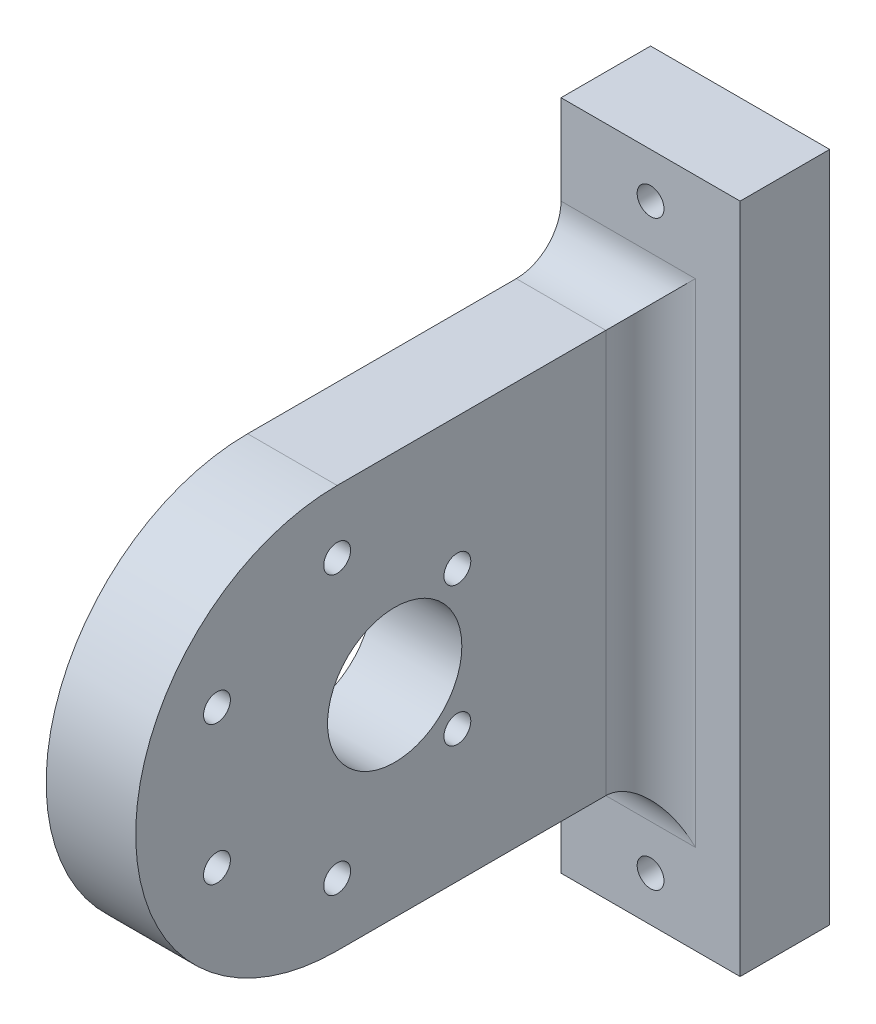
ISO-10303-21;
HEADER;
FILE_DESCRIPTION(('STEP AP214'),'2;1');
FILE_NAME('part.step','',(''),(''),'','','');
FILE_SCHEMA(('AUTOMOTIVE_DESIGN { 1 0 10303 214 1 1 1 1 }'));
ENDSEC;
DATA;
#1=APPLICATION_CONTEXT('core data for automotive mechanical design processes');
#2=APPLICATION_PROTOCOL_DEFINITION('international standard','automotive_design',2000,#1);
#3=PRODUCT_CONTEXT('',#1,'mechanical');
#4=PRODUCT('Part','Part','',(#3));
#5=PRODUCT_RELATED_PRODUCT_CATEGORY('part','',(#4));
#6=PRODUCT_DEFINITION_FORMATION('','',#4);
#7=PRODUCT_DEFINITION_CONTEXT('part definition',#1,'design');
#8=PRODUCT_DEFINITION('design','',#6,#7);
#9=PRODUCT_DEFINITION_SHAPE('','',#8);
#10=(LENGTH_UNIT() NAMED_UNIT(*) SI_UNIT(.MILLI.,.METRE.));
#11=(NAMED_UNIT(*) PLANE_ANGLE_UNIT() SI_UNIT($,.RADIAN.));
#12=(NAMED_UNIT(*) SI_UNIT($,.STERADIAN.) SOLID_ANGLE_UNIT());
#13=UNCERTAINTY_MEASURE_WITH_UNIT(LENGTH_MEASURE(1.E-05),#10,'distance_accuracy_value','');
#14=(GEOMETRIC_REPRESENTATION_CONTEXT(3) GLOBAL_UNCERTAINTY_ASSIGNED_CONTEXT((#13)) GLOBAL_UNIT_ASSIGNED_CONTEXT((#10,
#11,#12)) REPRESENTATION_CONTEXT('',''));
#15=CARTESIAN_POINT('',(0.,0.,0.));
#16=DIRECTION('',(0.,0.,1.));
#17=DIRECTION('',(1.,0.,0.));
#18=AXIS2_PLACEMENT_3D('',#15,#16,#17);
#19=CARTESIAN_POINT('',(15.,22.5,-30.));
#20=DIRECTION('',(0.,-1.,0.));
#21=DIRECTION('',(0.,0.,-1.));
#22=AXIS2_PLACEMENT_3D('',#19,#20,#21);
#23=CYLINDRICAL_SURFACE('',#22,5.);
#24=DIRECTION('',(0.,1.,0.));
#25=VECTOR('',#24,1.);
#26=CARTESIAN_POINT('',(10.,22.5,-30.));
#27=LINE('',#26,#25);
#28=CARTESIAN_POINT('',(10.,0.,-30.));
#29=VERTEX_POINT('',#28);
#30=CARTESIAN_POINT('',(10.,45.,-30.));
#31=VERTEX_POINT('',#30);
#32=EDGE_CURVE('E237',#29,#31,#27,.T.);
#33=ORIENTED_EDGE('',*,*,#32,.F.);
#34=CARTESIAN_POINT('',(15.,-5.,-30.));
#35=DIRECTION('',(-0.707106781186547,-0.707106781186547,0.));
#36=DIRECTION('',(-0.707106781186547,0.707106781186547,0.));
#37=AXIS2_PLACEMENT_3D('',#34,#35,#36);
#38=ELLIPSE('',#37,7.07106781186547,5.);
#39=CARTESIAN_POINT('',(15.,-5.,-35.));
#40=VERTEX_POINT('',#39);
#41=EDGE_CURVE('E42',#29,#40,#38,.T.);
#42=ORIENTED_EDGE('',*,*,#41,.T.);
#43=DIRECTION('',(0.,1.,0.));
#44=VECTOR('',#43,1.);
#45=CARTESIAN_POINT('',(15.,22.5,-35.));
#46=LINE('',#45,#44);
#47=CARTESIAN_POINT('',(15.,50.,-35.));
#48=VERTEX_POINT('',#47);
#49=EDGE_CURVE('E240',#48,#40,#46,.F.);
#50=ORIENTED_EDGE('',*,*,#49,.F.);
#51=CARTESIAN_POINT('',(15.,50.,-30.));
#52=DIRECTION('',(0.707106781186547,-0.707106781186547,0.));
#53=DIRECTION('',(0.707106781186547,0.707106781186547,0.));
#54=AXIS2_PLACEMENT_3D('',#51,#52,#53);
#55=ELLIPSE('',#54,7.07106781186547,5.);
#56=EDGE_CURVE('E11',#48,#31,#55,.F.);
#57=ORIENTED_EDGE('',*,*,#56,.T.);
#58=EDGE_LOOP('',(#33,#42,#50,#57));
#59=FACE_BOUND('',#58,.T.);
#60=ADVANCED_FACE('F35',(#59),#23,.F.);
#61=CARTESIAN_POINT('',(10.,22.5,0.));
#62=DIRECTION('',(-1.,0.,0.));
#63=DIRECTION('',(0.,0.,1.));
#64=AXIS2_PLACEMENT_3D('',#61,#62,#63);
#65=PLANE('',#64);
#66=CARTESIAN_POINT('',(10.,22.5,-6.42339375865879));
#67=DIRECTION('',(1.,0.,0.));
#68=DIRECTION('',(0.,0.,-1.));
#69=AXIS2_PLACEMENT_3D('',#66,#67,#68);
#70=CIRCLE('',#69,7.5);
#71=CARTESIAN_POINT('',(10.,22.5,-13.9233937586588));
#72=VERTEX_POINT('',#71);
#73=EDGE_CURVE('E148',#72,#72,#70,.T.);
#74=ORIENTED_EDGE('',*,*,#73,.F.);
#75=EDGE_LOOP('',(#74));
#76=FACE_BOUND('',#75,.T.);
#77=CARTESIAN_POINT('',(10.,14.7500000000001,-13.4233937586589));
#78=DIRECTION('',(1.,0.,0.));
#79=DIRECTION('',(0.,0.,-1.));
#80=AXIS2_PLACEMENT_3D('',#77,#78,#79);
#81=CIRCLE('',#80,1.5);
#82=CARTESIAN_POINT('',(10.,14.7500000000001,-14.9233937586589));
#83=VERTEX_POINT('',#82);
#84=EDGE_CURVE('E154',#83,#83,#81,.T.);
#85=ORIENTED_EDGE('',*,*,#84,.F.);
#86=EDGE_LOOP('',(#85));
#87=FACE_BOUND('',#86,.T.);
#88=CARTESIAN_POINT('',(10.,7.,-1.08235921504137E-13));
#89=DIRECTION('',(1.,0.,0.));
#90=DIRECTION('',(0.,0.,-1.));
#91=AXIS2_PLACEMENT_3D('',#88,#89,#90);
#92=CIRCLE('',#91,1.5);
#93=CARTESIAN_POINT('',(10.,7.,-1.50000000000011));
#94=VERTEX_POINT('',#93);
#95=EDGE_CURVE('E160',#94,#94,#92,.T.);
#96=ORIENTED_EDGE('',*,*,#95,.F.);
#97=EDGE_LOOP('',(#96));
#98=FACE_BOUND('',#97,.T.);
#99=CARTESIAN_POINT('',(10.,14.7499999999999,13.4233937586588));
#100=DIRECTION('',(1.,0.,0.));
#101=DIRECTION('',(0.,0.,-1.));
#102=AXIS2_PLACEMENT_3D('',#99,#100,#101);
#103=CIRCLE('',#102,1.5);
#104=CARTESIAN_POINT('',(10.,14.7499999999999,11.9233937586588));
#105=VERTEX_POINT('',#104);
#106=EDGE_CURVE('E166',#105,#105,#103,.T.);
#107=ORIENTED_EDGE('',*,*,#106,.F.);
#108=EDGE_LOOP('',(#107));
#109=FACE_BOUND('',#108,.T.);
#110=CARTESIAN_POINT('',(10.,30.25,13.4233937586588));
#111=DIRECTION('',(1.,0.,0.));
#112=DIRECTION('',(0.,0.,-1.));
#113=AXIS2_PLACEMENT_3D('',#110,#111,#112);
#114=CIRCLE('',#113,1.5);
#115=CARTESIAN_POINT('',(10.,30.25,11.9233937586588));
#116=VERTEX_POINT('',#115);
#117=EDGE_CURVE('E172',#116,#116,#114,.T.);
#118=ORIENTED_EDGE('',*,*,#117,.F.);
#119=EDGE_LOOP('',(#118));
#120=FACE_BOUND('',#119,.T.);
#121=CARTESIAN_POINT('',(10.,38.,0.));
#122=DIRECTION('',(1.,0.,0.));
#123=DIRECTION('',(0.,0.,-1.));
#124=AXIS2_PLACEMENT_3D('',#121,#122,#123);
#125=CIRCLE('',#124,1.5);
#126=CARTESIAN_POINT('',(10.,38.,-1.5));
#127=VERTEX_POINT('',#126);
#128=EDGE_CURVE('E178',#127,#127,#125,.T.);
#129=ORIENTED_EDGE('',*,*,#128,.F.);
#130=EDGE_LOOP('',(#129));
#131=FACE_BOUND('',#130,.T.);
#132=CARTESIAN_POINT('',(10.,30.2500000000002,-13.4233937586587));
#133=DIRECTION('',(1.,0.,0.));
#134=DIRECTION('',(0.,0.,-1.));
#135=AXIS2_PLACEMENT_3D('',#132,#133,#134);
#136=CIRCLE('',#135,1.5);
#137=CARTESIAN_POINT('',(10.,30.2500000000002,-14.9233937586587));
#138=VERTEX_POINT('',#137);
#139=EDGE_CURVE('E184',#138,#138,#136,.T.);
#140=ORIENTED_EDGE('',*,*,#139,.F.);
#141=EDGE_LOOP('',(#140));
#142=FACE_BOUND('',#141,.T.);
#143=DIRECTION('',(0.,0.,-1.));
#144=VECTOR('',#143,1.);
#145=CARTESIAN_POINT('',(10.,0.,0.));
#146=LINE('',#145,#144);
#147=CARTESIAN_POINT('',(10.,0.,0.));
#148=VERTEX_POINT('',#147);
#149=EDGE_CURVE('E193',#148,#29,#146,.T.);
#150=ORIENTED_EDGE('',*,*,#149,.T.);
#151=ORIENTED_EDGE('',*,*,#32,.T.);
#152=DIRECTION('',(0.,0.,1.));
#153=VECTOR('',#152,1.);
#154=CARTESIAN_POINT('',(10.,45.,0.));
#155=LINE('',#154,#153);
#156=CARTESIAN_POINT('',(10.,45.,0.));
#157=VERTEX_POINT('',#156);
#158=EDGE_CURVE('E197',#31,#157,#155,.T.);
#159=ORIENTED_EDGE('',*,*,#158,.T.);
#160=CARTESIAN_POINT('',(10.,22.5,0.));
#161=DIRECTION('',(1.,0.,0.));
#162=DIRECTION('',(0.,0.,1.));
#163=AXIS2_PLACEMENT_3D('',#160,#161,#162);
#164=CIRCLE('',#163,22.5);
#165=EDGE_CURVE('E190',#157,#148,#164,.T.);
#166=ORIENTED_EDGE('',*,*,#165,.T.);
#167=EDGE_LOOP('',(#150,#151,#159,#166));
#168=FACE_BOUND('',#167,.T.);
#169=ADVANCED_FACE('F261',(#76,#87,#98,#109,#120,#131,#142,#168),#65,.F.);
#170=CARTESIAN_POINT('',(10.,-5.,-30.));
#171=DIRECTION('',(-1.,0.,0.));
#172=DIRECTION('',(0.,0.,1.));
#173=AXIS2_PLACEMENT_3D('',#170,#171,#172);
#174=CYLINDRICAL_SURFACE('',#173,5.);
#175=DIRECTION('',(1.,0.,0.));
#176=VECTOR('',#175,1.);
#177=CARTESIAN_POINT('',(10.,0.,-30.));
#178=LINE('',#177,#176);
#179=CARTESIAN_POINT('',(0.,0.,-30.));
#180=VERTEX_POINT('',#179);
#181=EDGE_CURVE('E231',#180,#29,#178,.T.);
#182=ORIENTED_EDGE('',*,*,#181,.F.);
#183=CARTESIAN_POINT('',(0.,-5.,-30.));
#184=DIRECTION('',(-1.,0.,0.));
#185=DIRECTION('',(0.,0.,1.));
#186=AXIS2_PLACEMENT_3D('',#183,#184,#185);
#187=CIRCLE('',#186,5.);
#188=CARTESIAN_POINT('',(0.,-5.,-35.));
#189=VERTEX_POINT('',#188);
#190=EDGE_CURVE('E235',#180,#189,#187,.T.);
#191=ORIENTED_EDGE('',*,*,#190,.T.);
#192=DIRECTION('',(1.,0.,0.));
#193=VECTOR('',#192,1.);
#194=CARTESIAN_POINT('',(10.,-5.,-35.));
#195=LINE('',#194,#193);
#196=EDGE_CURVE('E49',#40,#189,#195,.F.);
#197=ORIENTED_EDGE('',*,*,#196,.F.);
#198=ORIENTED_EDGE('',*,*,#41,.F.);
#199=EDGE_LOOP('',(#182,#191,#197,#198));
#200=FACE_BOUND('',#199,.T.);
#201=ADVANCED_FACE('F267',(#200),#174,.F.);
#202=CARTESIAN_POINT('',(10.,50.,-30.));
#203=DIRECTION('',(1.,0.,0.));
#204=DIRECTION('',(0.,0.,-1.));
#205=AXIS2_PLACEMENT_3D('',#202,#203,#204);
#206=CYLINDRICAL_SURFACE('',#205,5.);
#207=DIRECTION('',(-1.,0.,0.));
#208=VECTOR('',#207,1.);
#209=CARTESIAN_POINT('',(10.,45.,-30.));
#210=LINE('',#209,#208);
#211=CARTESIAN_POINT('',(0.,45.,-30.));
#212=VERTEX_POINT('',#211);
#213=EDGE_CURVE('E225',#31,#212,#210,.T.);
#214=ORIENTED_EDGE('',*,*,#213,.F.);
#215=ORIENTED_EDGE('',*,*,#56,.F.);
#216=DIRECTION('',(-1.,0.,0.));
#217=VECTOR('',#216,1.);
#218=CARTESIAN_POINT('',(10.,50.,-35.));
#219=LINE('',#218,#217);
#220=CARTESIAN_POINT('',(0.,50.,-35.));
#221=VERTEX_POINT('',#220);
#222=EDGE_CURVE('E57',#221,#48,#219,.F.);
#223=ORIENTED_EDGE('',*,*,#222,.F.);
#224=CARTESIAN_POINT('',(0.,50.,-30.));
#225=DIRECTION('',(-1.,0.,0.));
#226=DIRECTION('',(0.,0.,1.));
#227=AXIS2_PLACEMENT_3D('',#224,#225,#226);
#228=CIRCLE('',#227,5.);
#229=EDGE_CURVE('E229',#221,#212,#228,.T.);
#230=ORIENTED_EDGE('',*,*,#229,.T.);
#231=EDGE_LOOP('',(#214,#215,#223,#230));
#232=FACE_BOUND('',#231,.T.);
#233=ADVANCED_FACE('F258',(#232),#206,.F.);
#234=CARTESIAN_POINT('',(0.,22.5,0.));
#235=DIRECTION('',(-1.,0.,0.));
#236=DIRECTION('',(0.,0.,1.));
#237=AXIS2_PLACEMENT_3D('',#234,#235,#236);
#238=PLANE('',#237);
#239=CARTESIAN_POINT('',(0.,14.7500000000001,-13.4233937586589));
#240=DIRECTION('',(1.,0.,0.));
#241=DIRECTION('',(0.,0.,-1.));
#242=AXIS2_PLACEMENT_3D('',#239,#240,#241);
#243=CIRCLE('',#242,1.5);
#244=CARTESIAN_POINT('',(0.,14.7500000000001,-14.9233937586589));
#245=VERTEX_POINT('',#244);
#246=EDGE_CURVE('E151',#245,#245,#243,.T.);
#247=ORIENTED_EDGE('',*,*,#246,.T.);
#248=EDGE_LOOP('',(#247));
#249=FACE_BOUND('',#248,.T.);
#250=CARTESIAN_POINT('',(0.,14.7499999999999,13.4233937586588));
#251=DIRECTION('',(1.,0.,0.));
#252=DIRECTION('',(0.,0.,-1.));
#253=AXIS2_PLACEMENT_3D('',#250,#251,#252);
#254=CIRCLE('',#253,1.5);
#255=CARTESIAN_POINT('',(0.,14.7499999999999,11.9233937586588));
#256=VERTEX_POINT('',#255);
#257=EDGE_CURVE('E163',#256,#256,#254,.T.);
#258=ORIENTED_EDGE('',*,*,#257,.T.);
#259=EDGE_LOOP('',(#258));
#260=FACE_BOUND('',#259,.T.);
#261=CARTESIAN_POINT('',(0.,38.,0.));
#262=DIRECTION('',(1.,0.,0.));
#263=DIRECTION('',(0.,0.,-1.));
#264=AXIS2_PLACEMENT_3D('',#261,#262,#263);
#265=CIRCLE('',#264,1.5);
#266=CARTESIAN_POINT('',(0.,38.,-1.5));
#267=VERTEX_POINT('',#266);
#268=EDGE_CURVE('E175',#267,#267,#265,.T.);
#269=ORIENTED_EDGE('',*,*,#268,.T.);
#270=EDGE_LOOP('',(#269));
#271=FACE_BOUND('',#270,.T.);
#272=CARTESIAN_POINT('',(0.,22.5,0.));
#273=DIRECTION('',(1.,0.,0.));
#274=DIRECTION('',(0.,0.,1.));
#275=AXIS2_PLACEMENT_3D('',#272,#273,#274);
#276=CIRCLE('',#275,22.5);
#277=CARTESIAN_POINT('',(0.,45.,0.));
#278=VERTEX_POINT('',#277);
#279=CARTESIAN_POINT('',(0.,0.,0.));
#280=VERTEX_POINT('',#279);
#281=EDGE_CURVE('E187',#278,#280,#276,.T.);
#282=ORIENTED_EDGE('',*,*,#281,.F.);
#283=DIRECTION('',(0.,0.,1.));
#284=VECTOR('',#283,1.);
#285=CARTESIAN_POINT('',(0.,45.,0.));
#286=LINE('',#285,#284);
#287=EDGE_CURVE('E194',#212,#278,#286,.T.);
#288=ORIENTED_EDGE('',*,*,#287,.F.);
#289=ORIENTED_EDGE('',*,*,#229,.F.);
#290=DIRECTION('',(0.,-1.,0.));
#291=VECTOR('',#290,1.);
#292=CARTESIAN_POINT('',(0.,45.,-35.));
#293=LINE('',#292,#291);
#294=CARTESIAN_POINT('',(0.,60.,-35.));
#295=VERTEX_POINT('',#294);
#296=EDGE_CURVE('E212',#295,#221,#293,.T.);
#297=ORIENTED_EDGE('',*,*,#296,.F.);
#298=DIRECTION('',(0.,0.,1.));
#299=VECTOR('',#298,1.);
#300=CARTESIAN_POINT('',(0.,60.,-35.));
#301=LINE('',#300,#299);
#302=CARTESIAN_POINT('',(0.,60.,-45.));
#303=VERTEX_POINT('',#302);
#304=EDGE_CURVE('E210',#303,#295,#301,.T.);
#305=ORIENTED_EDGE('',*,*,#304,.F.);
#306=DIRECTION('',(0.,1.,0.));
#307=VECTOR('',#306,1.);
#308=CARTESIAN_POINT('',(0.,-15.,-45.));
#309=LINE('',#308,#307);
#310=CARTESIAN_POINT('',(0.,-15.,-45.));
#311=VERTEX_POINT('',#310);
#312=EDGE_CURVE('E119',#311,#303,#309,.T.);
#313=ORIENTED_EDGE('',*,*,#312,.F.);
#314=DIRECTION('',(0.,0.,-1.));
#315=VECTOR('',#314,1.);
#316=CARTESIAN_POINT('',(0.,-15.,-35.));
#317=LINE('',#316,#315);
#318=CARTESIAN_POINT('',(0.,-15.,-35.));
#319=VERTEX_POINT('',#318);
#320=EDGE_CURVE('E207',#319,#311,#317,.T.);
#321=ORIENTED_EDGE('',*,*,#320,.F.);
#322=DIRECTION('',(0.,-1.,0.));
#323=VECTOR('',#322,1.);
#324=CARTESIAN_POINT('',(0.,0.,-35.));
#325=LINE('',#324,#323);
#326=EDGE_CURVE('E205',#189,#319,#325,.T.);
#327=ORIENTED_EDGE('',*,*,#326,.F.);
#328=ORIENTED_EDGE('',*,*,#190,.F.);
#329=DIRECTION('',(0.,0.,-1.));
#330=VECTOR('',#329,1.);
#331=CARTESIAN_POINT('',(0.,0.,0.));
#332=LINE('',#331,#330);
#333=EDGE_CURVE('E202',#280,#180,#332,.T.);
#334=ORIENTED_EDGE('',*,*,#333,.F.);
#335=EDGE_LOOP('',(#282,#288,#289,#297,#305,#313,#321,#327,#328,#334));
#336=FACE_BOUND('',#335,.T.);
#337=CARTESIAN_POINT('',(0.,30.2500000000002,-13.4233937586587));
#338=DIRECTION('',(1.,0.,0.));
#339=DIRECTION('',(0.,0.,-1.));
#340=AXIS2_PLACEMENT_3D('',#337,#338,#339);
#341=CIRCLE('',#340,1.5);
#342=CARTESIAN_POINT('',(0.,30.2500000000002,-14.9233937586587));
#343=VERTEX_POINT('',#342);
#344=EDGE_CURVE('E181',#343,#343,#341,.T.);
#345=ORIENTED_EDGE('',*,*,#344,.T.);
#346=EDGE_LOOP('',(#345));
#347=FACE_BOUND('',#346,.T.);
#348=CARTESIAN_POINT('',(0.,30.25,13.4233937586588));
#349=DIRECTION('',(1.,0.,0.));
#350=DIRECTION('',(0.,0.,-1.));
#351=AXIS2_PLACEMENT_3D('',#348,#349,#350);
#352=CIRCLE('',#351,1.5);
#353=CARTESIAN_POINT('',(0.,30.25,11.9233937586588));
#354=VERTEX_POINT('',#353);
#355=EDGE_CURVE('E169',#354,#354,#352,.T.);
#356=ORIENTED_EDGE('',*,*,#355,.T.);
#357=EDGE_LOOP('',(#356));
#358=FACE_BOUND('',#357,.T.);
#359=CARTESIAN_POINT('',(0.,7.,-1.08235921504137E-13));
#360=DIRECTION('',(1.,0.,0.));
#361=DIRECTION('',(0.,0.,-1.));
#362=AXIS2_PLACEMENT_3D('',#359,#360,#361);
#363=CIRCLE('',#362,1.5);
#364=CARTESIAN_POINT('',(0.,7.,-1.50000000000011));
#365=VERTEX_POINT('',#364);
#366=EDGE_CURVE('E157',#365,#365,#363,.T.);
#367=ORIENTED_EDGE('',*,*,#366,.T.);
#368=EDGE_LOOP('',(#367));
#369=FACE_BOUND('',#368,.T.);
#370=CARTESIAN_POINT('',(0.,22.5,-6.42339375865879));
#371=DIRECTION('',(1.,0.,0.));
#372=DIRECTION('',(0.,0.,-1.));
#373=AXIS2_PLACEMENT_3D('',#370,#371,#372);
#374=CIRCLE('',#373,7.5);
#375=CARTESIAN_POINT('',(0.,22.5,-13.9233937586588));
#376=VERTEX_POINT('',#375);
#377=EDGE_CURVE('E147',#376,#376,#374,.T.);
#378=ORIENTED_EDGE('',*,*,#377,.T.);
#379=EDGE_LOOP('',(#378));
#380=FACE_BOUND('',#379,.T.);
#381=ADVANCED_FACE('F250',(#249,#260,#271,#336,#347,#358,#369,#380),#238,.T.);
#382=CARTESIAN_POINT('',(10.,22.5,0.));
#383=DIRECTION('',(-1.,0.,0.));
#384=DIRECTION('',(0.,0.,1.));
#385=AXIS2_PLACEMENT_3D('',#382,#383,#384);
#386=CYLINDRICAL_SURFACE('',#385,22.5);
#387=ORIENTED_EDGE('',*,*,#281,.T.);
#388=DIRECTION('',(-1.,0.,0.));
#389=VECTOR('',#388,1.);
#390=CARTESIAN_POINT('',(10.,0.,0.));
#391=LINE('',#390,#389);
#392=EDGE_CURVE('E222',#148,#280,#391,.T.);
#393=ORIENTED_EDGE('',*,*,#392,.F.);
#394=ORIENTED_EDGE('',*,*,#165,.F.);
#395=DIRECTION('',(-1.,0.,0.));
#396=VECTOR('',#395,1.);
#397=CARTESIAN_POINT('',(10.,45.,0.));
#398=LINE('',#397,#396);
#399=EDGE_CURVE('E199',#157,#278,#398,.T.);
#400=ORIENTED_EDGE('',*,*,#399,.T.);
#401=EDGE_LOOP('',(#387,#393,#394,#400));
#402=FACE_BOUND('',#401,.T.);
#403=ADVANCED_FACE('F381',(#402),#386,.T.);
#404=CARTESIAN_POINT('',(10.,0.,0.));
#405=DIRECTION('',(0.,1.,0.));
#406=DIRECTION('',(0.,0.,1.));
#407=AXIS2_PLACEMENT_3D('',#404,#405,#406);
#408=PLANE('',#407);
#409=ORIENTED_EDGE('',*,*,#333,.T.);
#410=ORIENTED_EDGE('',*,*,#181,.T.);
#411=ORIENTED_EDGE('',*,*,#149,.F.);
#412=ORIENTED_EDGE('',*,*,#392,.T.);
#413=EDGE_LOOP('',(#409,#410,#411,#412));
#414=FACE_BOUND('',#413,.T.);
#415=ADVANCED_FACE('F266',(#414),#408,.F.);
#416=CARTESIAN_POINT('',(10.,-15.,-35.));
#417=DIRECTION('',(0.,1.,0.));
#418=DIRECTION('',(0.,0.,1.));
#419=AXIS2_PLACEMENT_3D('',#416,#417,#418);
#420=PLANE('',#419);
#421=ORIENTED_EDGE('',*,*,#320,.T.);
#422=DIRECTION('',(-1.,0.,0.));
#423=VECTOR('',#422,1.);
#424=CARTESIAN_POINT('',(10.,-15.,-45.));
#425=LINE('',#424,#423);
#426=CARTESIAN_POINT('',(20.,-15.,-45.));
#427=VERTEX_POINT('',#426);
#428=EDGE_CURVE('E122',#427,#311,#425,.T.);
#429=ORIENTED_EDGE('',*,*,#428,.F.);
#430=DIRECTION('',(0.,0.,-1.));
#431=VECTOR('',#430,1.);
#432=CARTESIAN_POINT('',(20.,-15.,-45.));
#433=LINE('',#432,#431);
#434=CARTESIAN_POINT('',(20.,-15.,-35.));
#435=VERTEX_POINT('',#434);
#436=EDGE_CURVE('E137',#435,#427,#433,.T.);
#437=ORIENTED_EDGE('',*,*,#436,.F.);
#438=DIRECTION('',(-1.,0.,0.));
#439=VECTOR('',#438,1.);
#440=CARTESIAN_POINT('',(10.,-15.,-35.));
#441=LINE('',#440,#439);
#442=EDGE_CURVE('E219',#435,#319,#441,.T.);
#443=ORIENTED_EDGE('',*,*,#442,.T.);
#444=EDGE_LOOP('',(#421,#429,#437,#443));
#445=FACE_BOUND('',#444,.T.);
#446=ADVANCED_FACE('F253',(#445),#420,.F.);
#447=CARTESIAN_POINT('',(10.,-15.,-45.));
#448=DIRECTION('',(0.,0.,1.));
#449=DIRECTION('',(1.,0.,0.));
#450=AXIS2_PLACEMENT_3D('',#447,#448,#449);
#451=PLANE('',#450);
#452=CARTESIAN_POINT('',(10.,55.,-45.));
#453=DIRECTION('',(0.,0.,1.));
#454=DIRECTION('',(1.,0.,0.));
#455=AXIS2_PLACEMENT_3D('',#452,#453,#454);
#456=CIRCLE('',#455,1.5);
#457=CARTESIAN_POINT('',(11.5,55.,-45.));
#458=VERTEX_POINT('',#457);
#459=EDGE_CURVE('E518',#458,#458,#456,.T.);
#460=ORIENTED_EDGE('',*,*,#459,.T.);
#461=EDGE_LOOP('',(#460));
#462=FACE_BOUND('',#461,.T.);
#463=CARTESIAN_POINT('',(10.,-10.,-45.));
#464=DIRECTION('',(0.,0.,1.));
#465=DIRECTION('',(1.,0.,0.));
#466=AXIS2_PLACEMENT_3D('',#463,#464,#465);
#467=CIRCLE('',#466,1.5);
#468=CARTESIAN_POINT('',(11.5,-10.,-45.));
#469=VERTEX_POINT('',#468);
#470=EDGE_CURVE('E138',#469,#469,#467,.T.);
#471=ORIENTED_EDGE('',*,*,#470,.T.);
#472=EDGE_LOOP('',(#471));
#473=FACE_BOUND('',#472,.T.);
#474=ORIENTED_EDGE('',*,*,#312,.T.);
#475=DIRECTION('',(-1.,0.,0.));
#476=VECTOR('',#475,1.);
#477=CARTESIAN_POINT('',(10.,60.,-45.));
#478=LINE('',#477,#476);
#479=CARTESIAN_POINT('',(20.,60.,-45.));
#480=VERTEX_POINT('',#479);
#481=EDGE_CURVE('E112',#480,#303,#478,.T.);
#482=ORIENTED_EDGE('',*,*,#481,.F.);
#483=DIRECTION('',(0.,1.,0.));
#484=VECTOR('',#483,1.);
#485=CARTESIAN_POINT('',(20.,60.,-45.));
#486=LINE('',#485,#484);
#487=EDGE_CURVE('E117',#427,#480,#486,.T.);
#488=ORIENTED_EDGE('',*,*,#487,.F.);
#489=ORIENTED_EDGE('',*,*,#428,.T.);
#490=EDGE_LOOP('',(#474,#482,#488,#489));
#491=FACE_BOUND('',#490,.T.);
#492=ADVANCED_FACE('F114',(#462,#473,#491),#451,.F.);
#493=CARTESIAN_POINT('',(10.,60.,-35.));
#494=DIRECTION('',(0.,-1.,0.));
#495=DIRECTION('',(0.,0.,-1.));
#496=AXIS2_PLACEMENT_3D('',#493,#494,#495);
#497=PLANE('',#496);
#498=ORIENTED_EDGE('',*,*,#304,.T.);
#499=DIRECTION('',(-1.,0.,0.));
#500=VECTOR('',#499,1.);
#501=CARTESIAN_POINT('',(10.,60.,-35.));
#502=LINE('',#501,#500);
#503=CARTESIAN_POINT('',(20.,60.,-35.));
#504=VERTEX_POINT('',#503);
#505=EDGE_CURVE('E123',#504,#295,#502,.T.);
#506=ORIENTED_EDGE('',*,*,#505,.F.);
#507=DIRECTION('',(0.,0.,1.));
#508=VECTOR('',#507,1.);
#509=CARTESIAN_POINT('',(20.,60.,-45.));
#510=LINE('',#509,#508);
#511=EDGE_CURVE('E126',#480,#504,#510,.T.);
#512=ORIENTED_EDGE('',*,*,#511,.F.);
#513=ORIENTED_EDGE('',*,*,#481,.T.);
#514=EDGE_LOOP('',(#498,#506,#512,#513));
#515=FACE_BOUND('',#514,.T.);
#516=ADVANCED_FACE('F127',(#515),#497,.F.);
#517=CARTESIAN_POINT('',(10.,45.,-35.));
#518=DIRECTION('',(0.,0.,-1.));
#519=DIRECTION('',(-1.,0.,0.));
#520=AXIS2_PLACEMENT_3D('',#517,#518,#519);
#521=PLANE('',#520);
#522=CARTESIAN_POINT('',(10.,55.,-35.));
#523=DIRECTION('',(0.,0.,1.));
#524=DIRECTION('',(1.,0.,0.));
#525=AXIS2_PLACEMENT_3D('',#522,#523,#524);
#526=CIRCLE('',#525,1.5);
#527=CARTESIAN_POINT('',(11.5,55.,-35.));
#528=VERTEX_POINT('',#527);
#529=EDGE_CURVE('E521',#528,#528,#526,.T.);
#530=ORIENTED_EDGE('',*,*,#529,.F.);
#531=EDGE_LOOP('',(#530));
#532=FACE_BOUND('',#531,.T.);
#533=CARTESIAN_POINT('',(10.,-10.,-35.));
#534=DIRECTION('',(0.,0.,1.));
#535=DIRECTION('',(1.,0.,0.));
#536=AXIS2_PLACEMENT_3D('',#533,#534,#535);
#537=CIRCLE('',#536,1.5);
#538=CARTESIAN_POINT('',(11.5,-10.,-35.));
#539=VERTEX_POINT('',#538);
#540=EDGE_CURVE('E141',#539,#539,#537,.T.);
#541=ORIENTED_EDGE('',*,*,#540,.F.);
#542=EDGE_LOOP('',(#541));
#543=FACE_BOUND('',#542,.T.);
#544=ORIENTED_EDGE('',*,*,#49,.T.);
#545=ORIENTED_EDGE('',*,*,#196,.T.);
#546=ORIENTED_EDGE('',*,*,#326,.T.);
#547=ORIENTED_EDGE('',*,*,#442,.F.);
#548=DIRECTION('',(0.,-1.,0.));
#549=VECTOR('',#548,1.);
#550=CARTESIAN_POINT('',(20.,60.,-35.));
#551=LINE('',#550,#549);
#552=EDGE_CURVE('E132',#504,#435,#551,.T.);
#553=ORIENTED_EDGE('',*,*,#552,.F.);
#554=ORIENTED_EDGE('',*,*,#505,.T.);
#555=ORIENTED_EDGE('',*,*,#296,.T.);
#556=ORIENTED_EDGE('',*,*,#222,.T.);
#557=EDGE_LOOP('',(#544,#545,#546,#547,#553,#554,#555,#556));
#558=FACE_BOUND('',#557,.T.);
#559=ADVANCED_FACE('F245',(#532,#543,#558),#521,.F.);
#560=CARTESIAN_POINT('',(10.,45.,0.));
#561=DIRECTION('',(0.,-1.,0.));
#562=DIRECTION('',(0.,0.,-1.));
#563=AXIS2_PLACEMENT_3D('',#560,#561,#562);
#564=PLANE('',#563);
#565=ORIENTED_EDGE('',*,*,#158,.F.);
#566=ORIENTED_EDGE('',*,*,#213,.T.);
#567=ORIENTED_EDGE('',*,*,#287,.T.);
#568=ORIENTED_EDGE('',*,*,#399,.F.);
#569=EDGE_LOOP('',(#565,#566,#567,#568));
#570=FACE_BOUND('',#569,.T.);
#571=ADVANCED_FACE('F320',(#570),#564,.F.);
#572=CARTESIAN_POINT('',(10.,30.2500000000002,-13.4233937586587));
#573=DIRECTION('',(-1.,0.,0.));
#574=DIRECTION('',(0.,0.,1.));
#575=AXIS2_PLACEMENT_3D('',#572,#573,#574);
#576=CYLINDRICAL_SURFACE('',#575,1.5);
#577=ORIENTED_EDGE('',*,*,#139,.T.);
#578=EDGE_LOOP('',(#577));
#579=FACE_BOUND('',#578,.T.);
#580=ORIENTED_EDGE('',*,*,#344,.F.);
#581=EDGE_LOOP('',(#580));
#582=FACE_BOUND('',#581,.T.);
#583=ADVANCED_FACE('F375',(#579,#582),#576,.F.);
#584=CARTESIAN_POINT('',(10.,38.,0.));
#585=DIRECTION('',(-1.,0.,0.));
#586=DIRECTION('',(0.,0.,1.));
#587=AXIS2_PLACEMENT_3D('',#584,#585,#586);
#588=CYLINDRICAL_SURFACE('',#587,1.5);
#589=ORIENTED_EDGE('',*,*,#128,.T.);
#590=EDGE_LOOP('',(#589));
#591=FACE_BOUND('',#590,.T.);
#592=ORIENTED_EDGE('',*,*,#268,.F.);
#593=EDGE_LOOP('',(#592));
#594=FACE_BOUND('',#593,.T.);
#595=ADVANCED_FACE('F371',(#591,#594),#588,.F.);
#596=CARTESIAN_POINT('',(10.,30.25,13.4233937586588));
#597=DIRECTION('',(-1.,0.,0.));
#598=DIRECTION('',(0.,0.,1.));
#599=AXIS2_PLACEMENT_3D('',#596,#597,#598);
#600=CYLINDRICAL_SURFACE('',#599,1.5);
#601=ORIENTED_EDGE('',*,*,#117,.T.);
#602=EDGE_LOOP('',(#601));
#603=FACE_BOUND('',#602,.T.);
#604=ORIENTED_EDGE('',*,*,#355,.F.);
#605=EDGE_LOOP('',(#604));
#606=FACE_BOUND('',#605,.T.);
#607=ADVANCED_FACE('F367',(#603,#606),#600,.F.);
#608=CARTESIAN_POINT('',(10.,14.7499999999999,13.4233937586588));
#609=DIRECTION('',(-1.,0.,0.));
#610=DIRECTION('',(0.,0.,1.));
#611=AXIS2_PLACEMENT_3D('',#608,#609,#610);
#612=CYLINDRICAL_SURFACE('',#611,1.5);
#613=ORIENTED_EDGE('',*,*,#106,.T.);
#614=EDGE_LOOP('',(#613));
#615=FACE_BOUND('',#614,.T.);
#616=ORIENTED_EDGE('',*,*,#257,.F.);
#617=EDGE_LOOP('',(#616));
#618=FACE_BOUND('',#617,.T.);
#619=ADVANCED_FACE('F363',(#615,#618),#612,.F.);
#620=CARTESIAN_POINT('',(10.,7.,-1.08235921504137E-13));
#621=DIRECTION('',(-1.,0.,0.));
#622=DIRECTION('',(0.,0.,1.));
#623=AXIS2_PLACEMENT_3D('',#620,#621,#622);
#624=CYLINDRICAL_SURFACE('',#623,1.5);
#625=ORIENTED_EDGE('',*,*,#95,.T.);
#626=EDGE_LOOP('',(#625));
#627=FACE_BOUND('',#626,.T.);
#628=ORIENTED_EDGE('',*,*,#366,.F.);
#629=EDGE_LOOP('',(#628));
#630=FACE_BOUND('',#629,.T.);
#631=ADVANCED_FACE('F359',(#627,#630),#624,.F.);
#632=CARTESIAN_POINT('',(10.,14.7500000000001,-13.4233937586589));
#633=DIRECTION('',(-1.,0.,0.));
#634=DIRECTION('',(0.,0.,1.));
#635=AXIS2_PLACEMENT_3D('',#632,#633,#634);
#636=CYLINDRICAL_SURFACE('',#635,1.5);
#637=ORIENTED_EDGE('',*,*,#84,.T.);
#638=EDGE_LOOP('',(#637));
#639=FACE_BOUND('',#638,.T.);
#640=ORIENTED_EDGE('',*,*,#246,.F.);
#641=EDGE_LOOP('',(#640));
#642=FACE_BOUND('',#641,.T.);
#643=ADVANCED_FACE('F355',(#639,#642),#636,.F.);
#644=CARTESIAN_POINT('',(10.,22.5,-6.42339375865879));
#645=DIRECTION('',(-1.,0.,0.));
#646=DIRECTION('',(0.,0.,1.));
#647=AXIS2_PLACEMENT_3D('',#644,#645,#646);
#648=CYLINDRICAL_SURFACE('',#647,7.5);
#649=ORIENTED_EDGE('',*,*,#73,.T.);
#650=EDGE_LOOP('',(#649));
#651=FACE_BOUND('',#650,.T.);
#652=ORIENTED_EDGE('',*,*,#377,.F.);
#653=EDGE_LOOP('',(#652));
#654=FACE_BOUND('',#653,.T.);
#655=ADVANCED_FACE('F352',(#651,#654),#648,.F.);
#656=CARTESIAN_POINT('',(20.,0.,0.));
#657=DIRECTION('',(-1.,0.,0.));
#658=DIRECTION('',(0.,0.,1.));
#659=AXIS2_PLACEMENT_3D('',#656,#657,#658);
#660=PLANE('',#659);
#661=ORIENTED_EDGE('',*,*,#487,.T.);
#662=ORIENTED_EDGE('',*,*,#511,.T.);
#663=ORIENTED_EDGE('',*,*,#552,.T.);
#664=ORIENTED_EDGE('',*,*,#436,.T.);
#665=EDGE_LOOP('',(#661,#662,#663,#664));
#666=FACE_BOUND('',#665,.T.);
#667=ADVANCED_FACE('F135',(#666),#660,.F.);
#668=CARTESIAN_POINT('',(10.,-10.,-45.));
#669=DIRECTION('',(0.,0.,1.));
#670=DIRECTION('',(1.,0.,0.));
#671=AXIS2_PLACEMENT_3D('',#668,#669,#670);
#672=CYLINDRICAL_SURFACE('',#671,1.5);
#673=ORIENTED_EDGE('',*,*,#470,.F.);
#674=EDGE_LOOP('',(#673));
#675=FACE_BOUND('',#674,.T.);
#676=ORIENTED_EDGE('',*,*,#540,.T.);
#677=EDGE_LOOP('',(#676));
#678=FACE_BOUND('',#677,.T.);
#679=ADVANCED_FACE('F328',(#675,#678),#672,.F.);
#680=CARTESIAN_POINT('',(10.,55.,-45.));
#681=DIRECTION('',(0.,0.,1.));
#682=DIRECTION('',(1.,0.,0.));
#683=AXIS2_PLACEMENT_3D('',#680,#681,#682);
#684=CYLINDRICAL_SURFACE('',#683,1.5);
#685=ORIENTED_EDGE('',*,*,#459,.F.);
#686=EDGE_LOOP('',(#685));
#687=FACE_BOUND('',#686,.T.);
#688=ORIENTED_EDGE('',*,*,#529,.T.);
#689=EDGE_LOOP('',(#688));
#690=FACE_BOUND('',#689,.T.);
#691=ADVANCED_FACE('F333',(#687,#690),#684,.F.);
#692=CLOSED_SHELL('',(#60,#169,#201,#233,#381,#403,#415,#446,#492,#516,#559,#571,#583,#595,#607,
#619,#631,#643,#655,#667,#679,#691));
#693=MANIFOLD_SOLID_BREP('B2',#692);
#694=ADVANCED_BREP_SHAPE_REPRESENTATION('',(#18,#693),#14);
#695=SHAPE_DEFINITION_REPRESENTATION(#9,#694);
ENDSEC;
END-ISO-10303-21;
